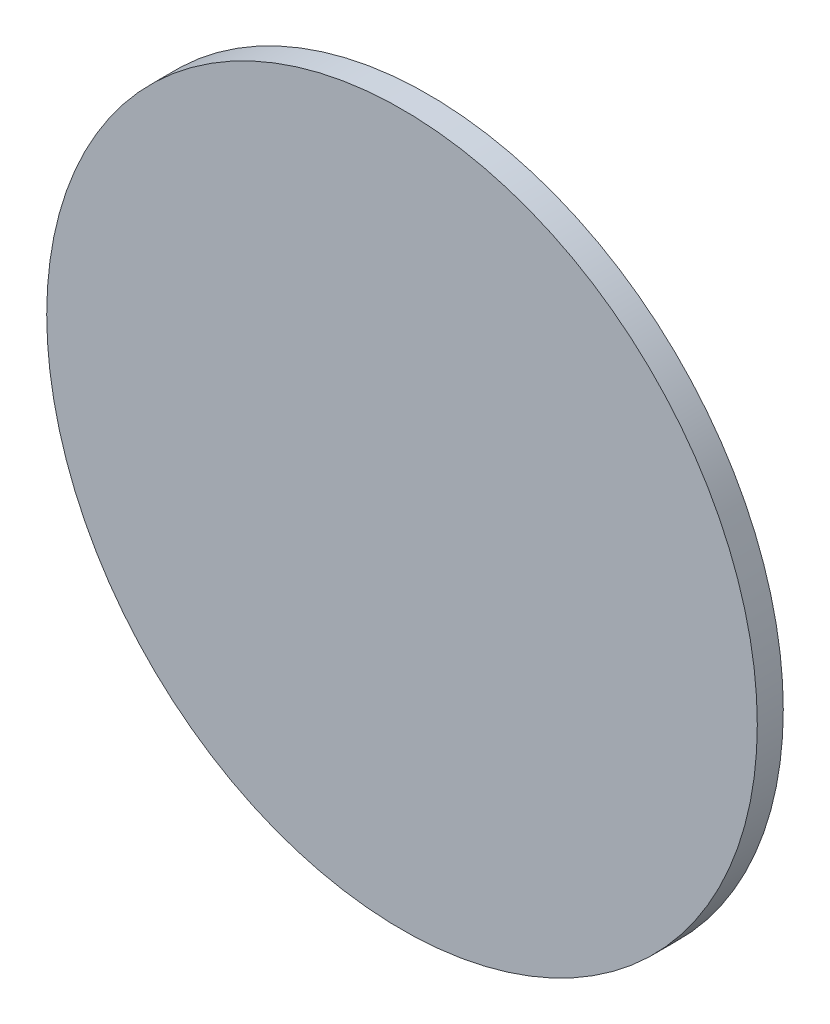
ISO-10303-21;
HEADER;
FILE_DESCRIPTION(('STEP AP214'),'2;1');
FILE_NAME('part.step','',(''),(''),'','','');
FILE_SCHEMA(('AUTOMOTIVE_DESIGN { 1 0 10303 214 1 1 1 1 }'));
ENDSEC;
DATA;
#1=APPLICATION_CONTEXT('core data for automotive mechanical design processes');
#2=APPLICATION_PROTOCOL_DEFINITION('international standard','automotive_design',2000,#1);
#3=PRODUCT_CONTEXT('',#1,'mechanical');
#4=PRODUCT('Part','Part','',(#3));
#5=PRODUCT_RELATED_PRODUCT_CATEGORY('part','',(#4));
#6=PRODUCT_DEFINITION_FORMATION('','',#4);
#7=PRODUCT_DEFINITION_CONTEXT('part definition',#1,'design');
#8=PRODUCT_DEFINITION('design','',#6,#7);
#9=PRODUCT_DEFINITION_SHAPE('','',#8);
#10=(LENGTH_UNIT() NAMED_UNIT(*) SI_UNIT(.MILLI.,.METRE.));
#11=(NAMED_UNIT(*) PLANE_ANGLE_UNIT() SI_UNIT($,.RADIAN.));
#12=(NAMED_UNIT(*) SI_UNIT($,.STERADIAN.) SOLID_ANGLE_UNIT());
#13=UNCERTAINTY_MEASURE_WITH_UNIT(LENGTH_MEASURE(1.E-05),#10,'distance_accuracy_value','');
#14=(GEOMETRIC_REPRESENTATION_CONTEXT(3) GLOBAL_UNCERTAINTY_ASSIGNED_CONTEXT((#13)) GLOBAL_UNIT_ASSIGNED_CONTEXT((#10,
#11,#12)) REPRESENTATION_CONTEXT('',''));
#15=CARTESIAN_POINT('',(0.,0.,0.));
#16=DIRECTION('',(0.,0.,1.));
#17=DIRECTION('',(1.,0.,0.));
#18=AXIS2_PLACEMENT_3D('',#15,#16,#17);
#19=CARTESIAN_POINT('',(-7.041939828664,-1.730196746829,0.));
#20=DIRECTION('',(0.,0.,1.));
#21=DIRECTION('',(-1.,0.,0.));
#22=AXIS2_PLACEMENT_3D('',#19,#20,#21);
#23=CYLINDRICAL_SURFACE('',#22,0.136759373550324);
#24=CARTESIAN_POINT('',(-7.041939828664,-1.730196746829,0.01));
#25=DIRECTION('',(0.,0.,1.));
#26=DIRECTION('',(-1.,0.,0.));
#27=AXIS2_PLACEMENT_3D('',#24,#25,#26);
#28=CIRCLE('',#27,0.136759373550324);
#29=CARTESIAN_POINT('',(-6.905180455114,-1.730196746829,0.01));
#30=VERTEX_POINT('',#29);
#31=EDGE_CURVE('E11',#30,#30,#28,.T.);
#32=ORIENTED_EDGE('',*,*,#31,.F.);
#33=CARTESIAN_POINT('',(-6.905180455114,-1.730196746829,0.));
#34=CARTESIAN_POINT('',(-6.905180455114,-1.730196746829,0.01));
#35=B_SPLINE_CURVE_WITH_KNOTS('',1,(#33,#34),.UNSPECIFIED.,.F.,.F.,(2,2),(0.,0.01),.UNSPECIFIED.);
#36=CARTESIAN_POINT('',(-6.905180455114,-1.730196746829,0.));
#37=VERTEX_POINT('',#36);
#38=EDGE_CURVE('E24',#37,#30,#35,.T.);
#39=ORIENTED_EDGE('',*,*,#38,.F.);
#40=CARTESIAN_POINT('',(-7.041939828664,-1.730196746829,0.));
#41=DIRECTION('',(0.,0.,-1.));
#42=DIRECTION('',(-1.,0.,0.));
#43=AXIS2_PLACEMENT_3D('',#40,#41,#42);
#44=CIRCLE('',#43,0.136759373550324);
#45=EDGE_CURVE('E33',#37,#37,#44,.T.);
#46=ORIENTED_EDGE('',*,*,#45,.F.);
#47=ORIENTED_EDGE('',*,*,#38,.T.);
#48=EDGE_LOOP('',(#32,#39,#46,#47));
#49=FACE_BOUND('',#48,.T.);
#50=ADVANCED_FACE('F17',(#49),#23,.T.);
#51=CARTESIAN_POINT('',(-7.041939828664,-1.730196746829,0.));
#52=DIRECTION('',(0.,0.,1.));
#53=DIRECTION('',(1.,0.,0.));
#54=AXIS2_PLACEMENT_3D('',#51,#52,#53);
#55=PLANE('',#54);
#56=ORIENTED_EDGE('',*,*,#45,.T.);
#57=EDGE_LOOP('',(#56));
#58=FACE_BOUND('',#57,.T.);
#59=ADVANCED_FACE('F35',(#58),#55,.F.);
#60=CARTESIAN_POINT('',(-7.041939828664,-1.730196746829,0.01));
#61=DIRECTION('',(0.,0.,1.));
#62=DIRECTION('',(1.,0.,0.));
#63=AXIS2_PLACEMENT_3D('',#60,#61,#62);
#64=PLANE('',#63);
#65=ORIENTED_EDGE('',*,*,#31,.T.);
#66=EDGE_LOOP('',(#65));
#67=FACE_BOUND('',#66,.T.);
#68=ADVANCED_FACE('F43',(#67),#64,.T.);
#69=CLOSED_SHELL('',(#50,#59,#68));
#70=MANIFOLD_SOLID_BREP('B1',#69);
#71=ADVANCED_BREP_SHAPE_REPRESENTATION('',(#18,#70),#14);
#72=SHAPE_DEFINITION_REPRESENTATION(#9,#71);
ENDSEC;
END-ISO-10303-21;
